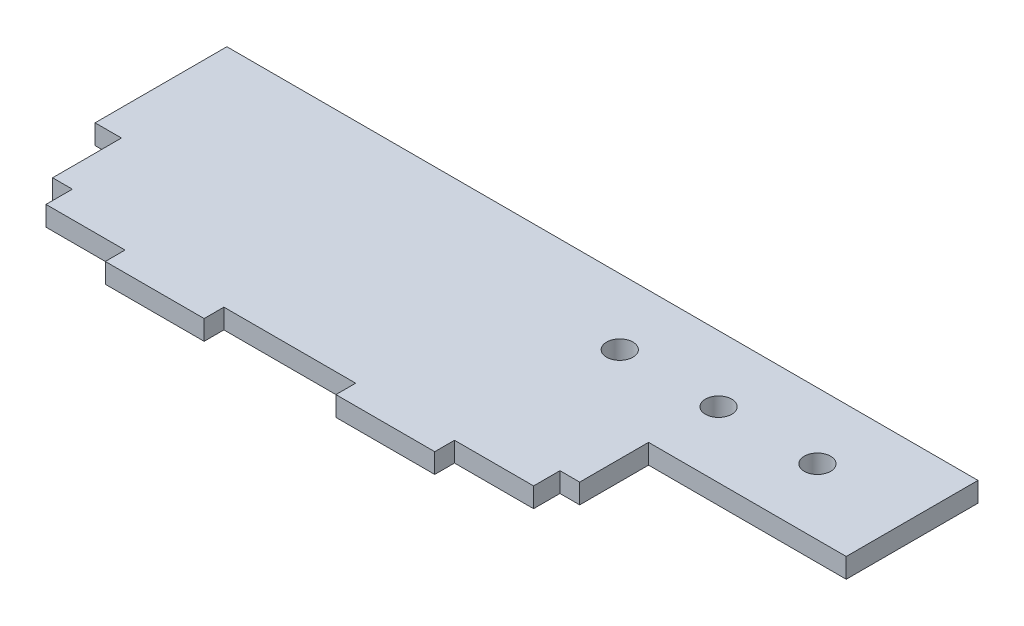
ISO-10303-21;
HEADER;
FILE_DESCRIPTION(('STEP AP214'),'2;1');
FILE_NAME('part.step','',(''),(''),'','','');
FILE_SCHEMA(('AUTOMOTIVE_DESIGN { 1 0 10303 214 1 1 1 1 }'));
ENDSEC;
DATA;
#1=APPLICATION_CONTEXT('core data for automotive mechanical design processes');
#2=APPLICATION_PROTOCOL_DEFINITION('international standard','automotive_design',2000,#1);
#3=PRODUCT_CONTEXT('',#1,'mechanical');
#4=PRODUCT('Part','Part','',(#3));
#5=PRODUCT_RELATED_PRODUCT_CATEGORY('part','',(#4));
#6=PRODUCT_DEFINITION_FORMATION('','',#4);
#7=PRODUCT_DEFINITION_CONTEXT('part definition',#1,'design');
#8=PRODUCT_DEFINITION('design','',#6,#7);
#9=PRODUCT_DEFINITION_SHAPE('','',#8);
#10=(LENGTH_UNIT() NAMED_UNIT(*) SI_UNIT(.MILLI.,.METRE.));
#11=(NAMED_UNIT(*) PLANE_ANGLE_UNIT() SI_UNIT($,.RADIAN.));
#12=(NAMED_UNIT(*) SI_UNIT($,.STERADIAN.) SOLID_ANGLE_UNIT());
#13=UNCERTAINTY_MEASURE_WITH_UNIT(LENGTH_MEASURE(1.E-05),#10,'distance_accuracy_value','');
#14=(GEOMETRIC_REPRESENTATION_CONTEXT(3) GLOBAL_UNCERTAINTY_ASSIGNED_CONTEXT((#13)) GLOBAL_UNIT_ASSIGNED_CONTEXT((#10,
#11,#12)) REPRESENTATION_CONTEXT('',''));
#15=CARTESIAN_POINT('',(0.,0.,0.));
#16=DIRECTION('',(0.,0.,1.));
#17=DIRECTION('',(1.,0.,0.));
#18=AXIS2_PLACEMENT_3D('',#15,#16,#17);
#19=CARTESIAN_POINT('',(40.,3.,0.));
#20=DIRECTION('',(1.,0.,0.));
#21=DIRECTION('',(0.,0.,-1.));
#22=AXIS2_PLACEMENT_3D('',#19,#20,#21);
#23=PLANE('',#22);
#24=DIRECTION('',(0.,1.,0.));
#25=VECTOR('',#24,1.);
#26=CARTESIAN_POINT('',(40.,0.,13.225));
#27=LINE('',#26,#25);
#28=CARTESIAN_POINT('',(40.,0.,13.225));
#29=VERTEX_POINT('',#28);
#30=CARTESIAN_POINT('',(40.,3.,13.225));
#31=VERTEX_POINT('',#30);
#32=EDGE_CURVE('E328',#29,#31,#27,.T.);
#33=ORIENTED_EDGE('',*,*,#32,.F.);
#34=DIRECTION('',(0.,0.,1.));
#35=VECTOR('',#34,1.);
#36=CARTESIAN_POINT('',(40.,0.,0.));
#37=LINE('',#36,#35);
#38=CARTESIAN_POINT('',(40.,0.,2.77499999999999));
#39=VERTEX_POINT('',#38);
#40=EDGE_CURVE('E268',#39,#29,#37,.T.);
#41=ORIENTED_EDGE('',*,*,#40,.F.);
#42=DIRECTION('',(0.,-1.,0.));
#43=VECTOR('',#42,1.);
#44=CARTESIAN_POINT('',(40.,3.,2.77499999999999));
#45=LINE('',#44,#43);
#46=CARTESIAN_POINT('',(40.,3.,2.77499999999999));
#47=VERTEX_POINT('',#46);
#48=EDGE_CURVE('E11',#47,#39,#45,.T.);
#49=ORIENTED_EDGE('',*,*,#48,.F.);
#50=DIRECTION('',(0.,0.,1.));
#51=VECTOR('',#50,1.);
#52=CARTESIAN_POINT('',(40.,3.,0.));
#53=LINE('',#52,#51);
#54=EDGE_CURVE('E212',#47,#31,#53,.T.);
#55=ORIENTED_EDGE('',*,*,#54,.T.);
#56=EDGE_LOOP('',(#33,#41,#49,#55));
#57=FACE_BOUND('',#56,.T.);
#58=ADVANCED_FACE('F43',(#57),#23,.T.);
#59=CARTESIAN_POINT('',(0.,3.,2.77499999999999));
#60=DIRECTION('',(0.,0.,-1.));
#61=DIRECTION('',(-1.,0.,0.));
#62=AXIS2_PLACEMENT_3D('',#59,#60,#61);
#63=PLANE('',#62);
#64=DIRECTION('',(1.,0.,0.));
#65=VECTOR('',#64,1.);
#66=CARTESIAN_POINT('',(0.,0.,2.77499999999999));
#67=LINE('',#66,#65);
#68=CARTESIAN_POINT('',(70.,0.,2.77499999999999));
#69=VERTEX_POINT('',#68);
#70=EDGE_CURVE('E272',#39,#69,#67,.T.);
#71=ORIENTED_EDGE('',*,*,#70,.T.);
#72=DIRECTION('',(0.,-1.,0.));
#73=VECTOR('',#72,1.);
#74=CARTESIAN_POINT('',(70.,3.,2.77499999999999));
#75=LINE('',#74,#73);
#76=CARTESIAN_POINT('',(70.,3.,2.77499999999999));
#77=VERTEX_POINT('',#76);
#78=EDGE_CURVE('E51',#77,#69,#75,.T.);
#79=ORIENTED_EDGE('',*,*,#78,.F.);
#80=DIRECTION('',(1.,0.,0.));
#81=VECTOR('',#80,1.);
#82=CARTESIAN_POINT('',(0.,3.,2.77499999999999));
#83=LINE('',#82,#81);
#84=EDGE_CURVE('E323',#47,#77,#83,.T.);
#85=ORIENTED_EDGE('',*,*,#84,.F.);
#86=ORIENTED_EDGE('',*,*,#48,.T.);
#87=EDGE_LOOP('',(#71,#79,#85,#86));
#88=FACE_BOUND('',#87,.T.);
#89=ADVANCED_FACE('F322',(#88),#63,.F.);
#90=CARTESIAN_POINT('',(70.,3.,0.));
#91=DIRECTION('',(1.,0.,0.));
#92=DIRECTION('',(0.,0.,-1.));
#93=AXIS2_PLACEMENT_3D('',#90,#91,#92);
#94=PLANE('',#93);
#95=DIRECTION('',(0.,0.,1.));
#96=VECTOR('',#95,1.);
#97=CARTESIAN_POINT('',(70.,0.,0.));
#98=LINE('',#97,#96);
#99=CARTESIAN_POINT('',(70.,0.,-17.225));
#100=VERTEX_POINT('',#99);
#101=EDGE_CURVE('E278',#100,#69,#98,.T.);
#102=ORIENTED_EDGE('',*,*,#101,.F.);
#103=DIRECTION('',(0.,-1.,0.));
#104=VECTOR('',#103,1.);
#105=CARTESIAN_POINT('',(70.,3.,-17.225));
#106=LINE('',#105,#104);
#107=CARTESIAN_POINT('',(70.,3.,-17.225));
#108=VERTEX_POINT('',#107);
#109=EDGE_CURVE('E257',#108,#100,#106,.T.);
#110=ORIENTED_EDGE('',*,*,#109,.F.);
#111=DIRECTION('',(0.,0.,1.));
#112=VECTOR('',#111,1.);
#113=CARTESIAN_POINT('',(70.,3.,0.));
#114=LINE('',#113,#112);
#115=EDGE_CURVE('E319',#108,#77,#114,.T.);
#116=ORIENTED_EDGE('',*,*,#115,.T.);
#117=ORIENTED_EDGE('',*,*,#78,.T.);
#118=EDGE_LOOP('',(#102,#110,#116,#117));
#119=FACE_BOUND('',#118,.T.);
#120=ADVANCED_FACE('F315',(#119),#94,.T.);
#121=CARTESIAN_POINT('',(0.,3.,-17.225));
#122=DIRECTION('',(0.,0.,-1.));
#123=DIRECTION('',(-1.,0.,0.));
#124=AXIS2_PLACEMENT_3D('',#121,#122,#123);
#125=PLANE('',#124);
#126=DIRECTION('',(1.,0.,0.));
#127=VECTOR('',#126,1.);
#128=CARTESIAN_POINT('',(0.,0.,-17.225));
#129=LINE('',#128,#127);
#130=CARTESIAN_POINT('',(-44.,0.,-17.225));
#131=VERTEX_POINT('',#130);
#132=EDGE_CURVE('E286',#131,#100,#129,.T.);
#133=ORIENTED_EDGE('',*,*,#132,.F.);
#134=DIRECTION('',(0.,-1.,0.));
#135=VECTOR('',#134,1.);
#136=CARTESIAN_POINT('',(-44.,3.,-17.225));
#137=LINE('',#136,#135);
#138=CARTESIAN_POINT('',(-44.,3.,-17.225));
#139=VERTEX_POINT('',#138);
#140=EDGE_CURVE('E255',#139,#131,#137,.T.);
#141=ORIENTED_EDGE('',*,*,#140,.F.);
#142=DIRECTION('',(1.,0.,0.));
#143=VECTOR('',#142,1.);
#144=CARTESIAN_POINT('',(0.,3.,-17.225));
#145=LINE('',#144,#143);
#146=EDGE_CURVE('E312',#139,#108,#145,.T.);
#147=ORIENTED_EDGE('',*,*,#146,.T.);
#148=ORIENTED_EDGE('',*,*,#109,.T.);
#149=EDGE_LOOP('',(#133,#141,#147,#148));
#150=FACE_BOUND('',#149,.T.);
#151=ADVANCED_FACE('F311',(#150),#125,.T.);
#152=CARTESIAN_POINT('',(-44.,3.,0.));
#153=DIRECTION('',(1.,0.,0.));
#154=DIRECTION('',(0.,0.,-1.));
#155=AXIS2_PLACEMENT_3D('',#152,#153,#154);
#156=PLANE('',#155);
#157=DIRECTION('',(0.,0.,1.));
#158=VECTOR('',#157,1.);
#159=CARTESIAN_POINT('',(-44.,0.,0.));
#160=LINE('',#159,#158);
#161=CARTESIAN_POINT('',(-44.,0.,2.77499999999999));
#162=VERTEX_POINT('',#161);
#163=EDGE_CURVE('E289',#131,#162,#160,.T.);
#164=ORIENTED_EDGE('',*,*,#163,.T.);
#165=DIRECTION('',(0.,-1.,0.));
#166=VECTOR('',#165,1.);
#167=CARTESIAN_POINT('',(-44.,3.,2.77499999999999));
#168=LINE('',#167,#166);
#169=CARTESIAN_POINT('',(-44.,3.,2.77499999999999));
#170=VERTEX_POINT('',#169);
#171=EDGE_CURVE('E253',#170,#162,#168,.T.);
#172=ORIENTED_EDGE('',*,*,#171,.F.);
#173=DIRECTION('',(0.,0.,1.));
#174=VECTOR('',#173,1.);
#175=CARTESIAN_POINT('',(-44.,3.,0.));
#176=LINE('',#175,#174);
#177=EDGE_CURVE('E307',#139,#170,#176,.T.);
#178=ORIENTED_EDGE('',*,*,#177,.F.);
#179=ORIENTED_EDGE('',*,*,#140,.T.);
#180=EDGE_LOOP('',(#164,#172,#178,#179));
#181=FACE_BOUND('',#180,.T.);
#182=ADVANCED_FACE('F306',(#181),#156,.F.);
#183=CARTESIAN_POINT('',(0.,3.,2.77499999999999));
#184=DIRECTION('',(0.,0.,1.));
#185=DIRECTION('',(1.,0.,0.));
#186=AXIS2_PLACEMENT_3D('',#183,#184,#185);
#187=PLANE('',#186);
#188=DIRECTION('',(-1.,0.,0.));
#189=VECTOR('',#188,1.);
#190=CARTESIAN_POINT('',(0.,0.,2.77499999999999));
#191=LINE('',#190,#189);
#192=CARTESIAN_POINT('',(-40.,0.,2.77499999999999));
#193=VERTEX_POINT('',#192);
#194=EDGE_CURVE('E209',#193,#162,#191,.T.);
#195=ORIENTED_EDGE('',*,*,#194,.F.);
#196=DIRECTION('',(0.,-1.,0.));
#197=VECTOR('',#196,1.);
#198=CARTESIAN_POINT('',(-40.,3.,2.77499999999999));
#199=LINE('',#198,#197);
#200=CARTESIAN_POINT('',(-40.,3.,2.77499999999999));
#201=VERTEX_POINT('',#200);
#202=EDGE_CURVE('E251',#201,#193,#199,.T.);
#203=ORIENTED_EDGE('',*,*,#202,.F.);
#204=DIRECTION('',(-1.,0.,0.));
#205=VECTOR('',#204,1.);
#206=CARTESIAN_POINT('',(0.,3.,2.77499999999999));
#207=LINE('',#206,#205);
#208=EDGE_CURVE('E303',#201,#170,#207,.T.);
#209=ORIENTED_EDGE('',*,*,#208,.T.);
#210=ORIENTED_EDGE('',*,*,#171,.T.);
#211=EDGE_LOOP('',(#195,#203,#209,#210));
#212=FACE_BOUND('',#211,.T.);
#213=ADVANCED_FACE('F298',(#212),#187,.T.);
#214=CARTESIAN_POINT('',(-40.,3.,0.));
#215=DIRECTION('',(1.,0.,0.));
#216=DIRECTION('',(0.,0.,-1.));
#217=AXIS2_PLACEMENT_3D('',#214,#215,#216);
#218=PLANE('',#217);
#219=DIRECTION('',(0.,0.,1.));
#220=VECTOR('',#219,1.);
#221=CARTESIAN_POINT('',(-40.,0.,0.));
#222=LINE('',#221,#220);
#223=CARTESIAN_POINT('',(-40.,0.,13.225));
#224=VERTEX_POINT('',#223);
#225=EDGE_CURVE('E202',#193,#224,#222,.T.);
#226=ORIENTED_EDGE('',*,*,#225,.T.);
#227=DIRECTION('',(0.,1.,0.));
#228=VECTOR('',#227,1.);
#229=CARTESIAN_POINT('',(-40.,0.,13.225));
#230=LINE('',#229,#228);
#231=CARTESIAN_POINT('',(-40.,3.,13.225));
#232=VERTEX_POINT('',#231);
#233=EDGE_CURVE('E356',#224,#232,#230,.T.);
#234=ORIENTED_EDGE('',*,*,#233,.T.);
#235=DIRECTION('',(0.,0.,1.));
#236=VECTOR('',#235,1.);
#237=CARTESIAN_POINT('',(-40.,3.,0.));
#238=LINE('',#237,#236);
#239=EDGE_CURVE('E363',#201,#232,#238,.T.);
#240=ORIENTED_EDGE('',*,*,#239,.F.);
#241=ORIENTED_EDGE('',*,*,#202,.T.);
#242=EDGE_LOOP('',(#226,#234,#240,#241));
#243=FACE_BOUND('',#242,.T.);
#244=ADVANCED_FACE('F409',(#243),#218,.F.);
#245=CARTESIAN_POINT('',(0.,3.,17.225));
#246=DIRECTION('',(0.,0.,-1.));
#247=DIRECTION('',(-1.,0.,0.));
#248=AXIS2_PLACEMENT_3D('',#245,#246,#247);
#249=PLANE('',#248);
#250=DIRECTION('',(1.,0.,0.));
#251=VECTOR('',#250,1.);
#252=CARTESIAN_POINT('',(0.,3.,17.225));
#253=LINE('',#252,#251);
#254=CARTESIAN_POINT('',(-37.,3.,17.225));
#255=VERTEX_POINT('',#254);
#256=CARTESIAN_POINT('',(-25.,3.,17.225));
#257=VERTEX_POINT('',#256);
#258=EDGE_CURVE('E196',#255,#257,#253,.T.);
#259=ORIENTED_EDGE('',*,*,#258,.F.);
#260=DIRECTION('',(0.,1.,0.));
#261=VECTOR('',#260,1.);
#262=CARTESIAN_POINT('',(-37.,0.,17.225));
#263=LINE('',#262,#261);
#264=CARTESIAN_POINT('',(-37.,0.,17.225));
#265=VERTEX_POINT('',#264);
#266=EDGE_CURVE('E183',#265,#255,#263,.T.);
#267=ORIENTED_EDGE('',*,*,#266,.F.);
#268=DIRECTION('',(1.,0.,0.));
#269=VECTOR('',#268,1.);
#270=CARTESIAN_POINT('',(0.,0.,17.225));
#271=LINE('',#270,#269);
#272=CARTESIAN_POINT('',(-25.,0.,17.225));
#273=VERTEX_POINT('',#272);
#274=EDGE_CURVE('E194',#265,#273,#271,.T.);
#275=ORIENTED_EDGE('',*,*,#274,.T.);
#276=DIRECTION('',(0.,-1.,0.));
#277=VECTOR('',#276,1.);
#278=CARTESIAN_POINT('',(-25.,3.,17.225));
#279=LINE('',#278,#277);
#280=EDGE_CURVE('E249',#257,#273,#279,.T.);
#281=ORIENTED_EDGE('',*,*,#280,.F.);
#282=EDGE_LOOP('',(#259,#267,#275,#281));
#283=FACE_BOUND('',#282,.T.);
#284=ADVANCED_FACE('F192',(#283),#249,.F.);
#285=CARTESIAN_POINT('',(-25.,3.,0.));
#286=DIRECTION('',(1.,0.,0.));
#287=DIRECTION('',(0.,0.,-1.));
#288=AXIS2_PLACEMENT_3D('',#285,#286,#287);
#289=PLANE('',#288);
#290=DIRECTION('',(0.,0.,1.));
#291=VECTOR('',#290,1.);
#292=CARTESIAN_POINT('',(-25.,0.,0.));
#293=LINE('',#292,#291);
#294=CARTESIAN_POINT('',(-25.,0.,20.225));
#295=VERTEX_POINT('',#294);
#296=EDGE_CURVE('E201',#273,#295,#293,.T.);
#297=ORIENTED_EDGE('',*,*,#296,.T.);
#298=DIRECTION('',(0.,-1.,0.));
#299=VECTOR('',#298,1.);
#300=CARTESIAN_POINT('',(-25.,3.,20.225));
#301=LINE('',#300,#299);
#302=CARTESIAN_POINT('',(-25.,3.,20.225));
#303=VERTEX_POINT('',#302);
#304=EDGE_CURVE('E246',#303,#295,#301,.T.);
#305=ORIENTED_EDGE('',*,*,#304,.F.);
#306=DIRECTION('',(0.,0.,1.));
#307=VECTOR('',#306,1.);
#308=CARTESIAN_POINT('',(-25.,3.,0.));
#309=LINE('',#308,#307);
#310=EDGE_CURVE('E367',#257,#303,#309,.T.);
#311=ORIENTED_EDGE('',*,*,#310,.F.);
#312=ORIENTED_EDGE('',*,*,#280,.T.);
#313=EDGE_LOOP('',(#297,#305,#311,#312));
#314=FACE_BOUND('',#313,.T.);
#315=ADVANCED_FACE('F417',(#314),#289,.F.);
#316=CARTESIAN_POINT('',(0.,3.,20.225));
#317=DIRECTION('',(0.,0.,-1.));
#318=DIRECTION('',(-1.,0.,0.));
#319=AXIS2_PLACEMENT_3D('',#316,#317,#318);
#320=PLANE('',#319);
#321=DIRECTION('',(1.,0.,0.));
#322=VECTOR('',#321,1.);
#323=CARTESIAN_POINT('',(0.,0.,20.225));
#324=LINE('',#323,#322);
#325=CARTESIAN_POINT('',(-10.,0.,20.225));
#326=VERTEX_POINT('',#325);
#327=EDGE_CURVE('E206',#295,#326,#324,.T.);
#328=ORIENTED_EDGE('',*,*,#327,.T.);
#329=DIRECTION('',(0.,-1.,0.));
#330=VECTOR('',#329,1.);
#331=CARTESIAN_POINT('',(-10.,3.,20.225));
#332=LINE('',#331,#330);
#333=CARTESIAN_POINT('',(-10.,3.,20.225));
#334=VERTEX_POINT('',#333);
#335=EDGE_CURVE('E244',#334,#326,#332,.T.);
#336=ORIENTED_EDGE('',*,*,#335,.F.);
#337=DIRECTION('',(1.,0.,0.));
#338=VECTOR('',#337,1.);
#339=CARTESIAN_POINT('',(0.,3.,20.225));
#340=LINE('',#339,#338);
#341=EDGE_CURVE('E370',#303,#334,#340,.T.);
#342=ORIENTED_EDGE('',*,*,#341,.F.);
#343=ORIENTED_EDGE('',*,*,#304,.T.);
#344=EDGE_LOOP('',(#328,#336,#342,#343));
#345=FACE_BOUND('',#344,.T.);
#346=ADVANCED_FACE('F421',(#345),#320,.F.);
#347=CARTESIAN_POINT('',(-10.,3.,0.));
#348=DIRECTION('',(1.,0.,0.));
#349=DIRECTION('',(0.,0.,-1.));
#350=AXIS2_PLACEMENT_3D('',#347,#348,#349);
#351=PLANE('',#350);
#352=DIRECTION('',(0.,0.,1.));
#353=VECTOR('',#352,1.);
#354=CARTESIAN_POINT('',(-10.,0.,0.));
#355=LINE('',#354,#353);
#356=CARTESIAN_POINT('',(-10.,0.,17.225));
#357=VERTEX_POINT('',#356);
#358=EDGE_CURVE('E215',#357,#326,#355,.T.);
#359=ORIENTED_EDGE('',*,*,#358,.F.);
#360=DIRECTION('',(0.,-1.,0.));
#361=VECTOR('',#360,1.);
#362=CARTESIAN_POINT('',(-10.,3.,17.225));
#363=LINE('',#362,#361);
#364=CARTESIAN_POINT('',(-10.,3.,17.225));
#365=VERTEX_POINT('',#364);
#366=EDGE_CURVE('E242',#365,#357,#363,.T.);
#367=ORIENTED_EDGE('',*,*,#366,.F.);
#368=DIRECTION('',(0.,0.,1.));
#369=VECTOR('',#368,1.);
#370=CARTESIAN_POINT('',(-10.,3.,0.));
#371=LINE('',#370,#369);
#372=EDGE_CURVE('E372',#365,#334,#371,.T.);
#373=ORIENTED_EDGE('',*,*,#372,.T.);
#374=ORIENTED_EDGE('',*,*,#335,.T.);
#375=EDGE_LOOP('',(#359,#367,#373,#374));
#376=FACE_BOUND('',#375,.T.);
#377=ADVANCED_FACE('F423',(#376),#351,.T.);
#378=CARTESIAN_POINT('',(10.,0.,17.225));
#379=VERTEX_POINT('',#378);
#380=EDGE_CURVE('E205',#357,#379,#271,.T.);
#381=ORIENTED_EDGE('',*,*,#380,.T.);
#382=DIRECTION('',(0.,-1.,0.));
#383=VECTOR('',#382,1.);
#384=CARTESIAN_POINT('',(10.,3.,17.225));
#385=LINE('',#384,#383);
#386=CARTESIAN_POINT('',(10.,3.,17.225));
#387=VERTEX_POINT('',#386);
#388=EDGE_CURVE('E240',#387,#379,#385,.T.);
#389=ORIENTED_EDGE('',*,*,#388,.F.);
#390=EDGE_CURVE('E368',#365,#387,#253,.T.);
#391=ORIENTED_EDGE('',*,*,#390,.F.);
#392=ORIENTED_EDGE('',*,*,#366,.T.);
#393=EDGE_LOOP('',(#381,#389,#391,#392));
#394=FACE_BOUND('',#393,.T.);
#395=ADVANCED_FACE('F394',(#394),#249,.F.);
#396=CARTESIAN_POINT('',(10.,3.,0.));
#397=DIRECTION('',(1.,0.,0.));
#398=DIRECTION('',(0.,0.,-1.));
#399=AXIS2_PLACEMENT_3D('',#396,#397,#398);
#400=PLANE('',#399);
#401=DIRECTION('',(0.,0.,1.));
#402=VECTOR('',#401,1.);
#403=CARTESIAN_POINT('',(10.,0.,0.));
#404=LINE('',#403,#402);
#405=CARTESIAN_POINT('',(10.,0.,20.225));
#406=VERTEX_POINT('',#405);
#407=EDGE_CURVE('E214',#379,#406,#404,.T.);
#408=ORIENTED_EDGE('',*,*,#407,.T.);
#409=DIRECTION('',(0.,-1.,0.));
#410=VECTOR('',#409,1.);
#411=CARTESIAN_POINT('',(10.,3.,20.225));
#412=LINE('',#411,#410);
#413=CARTESIAN_POINT('',(10.,3.,20.225));
#414=VERTEX_POINT('',#413);
#415=EDGE_CURVE('E238',#414,#406,#412,.T.);
#416=ORIENTED_EDGE('',*,*,#415,.F.);
#417=DIRECTION('',(0.,0.,1.));
#418=VECTOR('',#417,1.);
#419=CARTESIAN_POINT('',(10.,3.,0.));
#420=LINE('',#419,#418);
#421=EDGE_CURVE('E375',#387,#414,#420,.T.);
#422=ORIENTED_EDGE('',*,*,#421,.F.);
#423=ORIENTED_EDGE('',*,*,#388,.T.);
#424=EDGE_LOOP('',(#408,#416,#422,#423));
#425=FACE_BOUND('',#424,.T.);
#426=ADVANCED_FACE('F397',(#425),#400,.F.);
#427=CARTESIAN_POINT('',(0.,3.,20.225));
#428=DIRECTION('',(0.,0.,1.));
#429=DIRECTION('',(1.,0.,0.));
#430=AXIS2_PLACEMENT_3D('',#427,#428,#429);
#431=PLANE('',#430);
#432=DIRECTION('',(-1.,0.,0.));
#433=VECTOR('',#432,1.);
#434=CARTESIAN_POINT('',(0.,0.,20.225));
#435=LINE('',#434,#433);
#436=CARTESIAN_POINT('',(25.,0.,20.225));
#437=VERTEX_POINT('',#436);
#438=EDGE_CURVE('E221',#437,#406,#435,.T.);
#439=ORIENTED_EDGE('',*,*,#438,.F.);
#440=DIRECTION('',(0.,-1.,0.));
#441=VECTOR('',#440,1.);
#442=CARTESIAN_POINT('',(25.,3.,20.225));
#443=LINE('',#442,#441);
#444=CARTESIAN_POINT('',(25.,3.,20.225));
#445=VERTEX_POINT('',#444);
#446=EDGE_CURVE('E235',#445,#437,#443,.T.);
#447=ORIENTED_EDGE('',*,*,#446,.F.);
#448=DIRECTION('',(-1.,0.,0.));
#449=VECTOR('',#448,1.);
#450=CARTESIAN_POINT('',(0.,3.,20.225));
#451=LINE('',#450,#449);
#452=EDGE_CURVE('E376',#445,#414,#451,.T.);
#453=ORIENTED_EDGE('',*,*,#452,.T.);
#454=ORIENTED_EDGE('',*,*,#415,.T.);
#455=EDGE_LOOP('',(#439,#447,#453,#454));
#456=FACE_BOUND('',#455,.T.);
#457=ADVANCED_FACE('F399',(#456),#431,.T.);
#458=CARTESIAN_POINT('',(25.,3.,0.));
#459=DIRECTION('',(1.,0.,0.));
#460=DIRECTION('',(0.,0.,-1.));
#461=AXIS2_PLACEMENT_3D('',#458,#459,#460);
#462=PLANE('',#461);
#463=DIRECTION('',(0.,0.,1.));
#464=VECTOR('',#463,1.);
#465=CARTESIAN_POINT('',(25.,0.,0.));
#466=LINE('',#465,#464);
#467=CARTESIAN_POINT('',(25.,0.,17.225));
#468=VERTEX_POINT('',#467);
#469=EDGE_CURVE('E213',#468,#437,#466,.T.);
#470=ORIENTED_EDGE('',*,*,#469,.F.);
#471=DIRECTION('',(0.,-1.,0.));
#472=VECTOR('',#471,1.);
#473=CARTESIAN_POINT('',(25.,3.,17.225));
#474=LINE('',#473,#472);
#475=CARTESIAN_POINT('',(25.,3.,17.225));
#476=VERTEX_POINT('',#475);
#477=EDGE_CURVE('E233',#476,#468,#474,.T.);
#478=ORIENTED_EDGE('',*,*,#477,.F.);
#479=DIRECTION('',(0.,0.,1.));
#480=VECTOR('',#479,1.);
#481=CARTESIAN_POINT('',(25.,3.,0.));
#482=LINE('',#481,#480);
#483=EDGE_CURVE('E281',#476,#445,#482,.T.);
#484=ORIENTED_EDGE('',*,*,#483,.T.);
#485=ORIENTED_EDGE('',*,*,#446,.T.);
#486=EDGE_LOOP('',(#470,#478,#484,#485));
#487=FACE_BOUND('',#486,.T.);
#488=ADVANCED_FACE('F402',(#487),#462,.T.);
#489=CARTESIAN_POINT('',(37.,0.,17.225));
#490=VERTEX_POINT('',#489);
#491=EDGE_CURVE('E204',#468,#490,#271,.T.);
#492=ORIENTED_EDGE('',*,*,#491,.T.);
#493=DIRECTION('',(0.,1.,0.));
#494=VECTOR('',#493,1.);
#495=CARTESIAN_POINT('',(37.,0.,17.225));
#496=LINE('',#495,#494);
#497=CARTESIAN_POINT('',(37.,3.,17.225));
#498=VERTEX_POINT('',#497);
#499=EDGE_CURVE('E336',#490,#498,#496,.T.);
#500=ORIENTED_EDGE('',*,*,#499,.T.);
#501=EDGE_CURVE('E236',#476,#498,#253,.T.);
#502=ORIENTED_EDGE('',*,*,#501,.F.);
#503=ORIENTED_EDGE('',*,*,#477,.T.);
#504=EDGE_LOOP('',(#492,#500,#502,#503));
#505=FACE_BOUND('',#504,.T.);
#506=ADVANCED_FACE('F404',(#505),#249,.F.);
#507=CARTESIAN_POINT('',(0.,3.,0.));
#508=DIRECTION('',(0.,1.,0.));
#509=DIRECTION('',(0.,0.,1.));
#510=AXIS2_PLACEMENT_3D('',#507,#508,#509);
#511=PLANE('',#510);
#512=DIRECTION('',(-1.,0.,0.));
#513=VECTOR('',#512,1.);
#514=CARTESIAN_POINT('',(-40.,3.,13.225));
#515=LINE('',#514,#513);
#516=CARTESIAN_POINT('',(-37.,3.,13.225));
#517=VERTEX_POINT('',#516);
#518=EDGE_CURVE('E188',#517,#232,#515,.T.);
#519=ORIENTED_EDGE('',*,*,#518,.F.);
#520=DIRECTION('',(0.,0.,-1.));
#521=VECTOR('',#520,1.);
#522=CARTESIAN_POINT('',(-37.,3.,17.225));
#523=LINE('',#522,#521);
#524=EDGE_CURVE('E345',#255,#517,#523,.T.);
#525=ORIENTED_EDGE('',*,*,#524,.F.);
#526=ORIENTED_EDGE('',*,*,#258,.T.);
#527=ORIENTED_EDGE('',*,*,#310,.T.);
#528=ORIENTED_EDGE('',*,*,#341,.T.);
#529=ORIENTED_EDGE('',*,*,#372,.F.);
#530=ORIENTED_EDGE('',*,*,#390,.T.);
#531=ORIENTED_EDGE('',*,*,#421,.T.);
#532=ORIENTED_EDGE('',*,*,#452,.F.);
#533=ORIENTED_EDGE('',*,*,#483,.F.);
#534=ORIENTED_EDGE('',*,*,#501,.T.);
#535=DIRECTION('',(0.,0.,1.));
#536=VECTOR('',#535,1.);
#537=CARTESIAN_POINT('',(37.,3.,17.225));
#538=LINE('',#537,#536);
#539=CARTESIAN_POINT('',(37.,3.,13.225));
#540=VERTEX_POINT('',#539);
#541=EDGE_CURVE('E342',#540,#498,#538,.T.);
#542=ORIENTED_EDGE('',*,*,#541,.F.);
#543=DIRECTION('',(-1.,0.,0.));
#544=VECTOR('',#543,1.);
#545=CARTESIAN_POINT('',(40.,3.,13.225));
#546=LINE('',#545,#544);
#547=EDGE_CURVE('E344',#31,#540,#546,.T.);
#548=ORIENTED_EDGE('',*,*,#547,.F.);
#549=ORIENTED_EDGE('',*,*,#54,.F.);
#550=ORIENTED_EDGE('',*,*,#84,.T.);
#551=ORIENTED_EDGE('',*,*,#115,.F.);
#552=ORIENTED_EDGE('',*,*,#146,.F.);
#553=ORIENTED_EDGE('',*,*,#177,.T.);
#554=ORIENTED_EDGE('',*,*,#208,.F.);
#555=ORIENTED_EDGE('',*,*,#239,.T.);
#556=EDGE_LOOP('',(#519,#525,#526,#527,#528,#529,#530,#531,#532,#533,#534,#542,#548,#549,#550,
#551,#552,#553,#554,#555));
#557=FACE_BOUND('',#556,.T.);
#558=CARTESIAN_POINT('',(55.63,3.,-7.22500000000001));
#559=DIRECTION('',(0.,1.,0.));
#560=DIRECTION('',(0.,0.,1.));
#561=AXIS2_PLACEMENT_3D('',#558,#559,#560);
#562=CIRCLE('',#561,2.);
#563=CARTESIAN_POINT('',(55.63,3.,-5.22500000000001));
#564=VERTEX_POINT('',#563);
#565=EDGE_CURVE('E263',#564,#564,#562,.T.);
#566=ORIENTED_EDGE('',*,*,#565,.F.);
#567=EDGE_LOOP('',(#566));
#568=FACE_BOUND('',#567,.T.);
#569=CARTESIAN_POINT('',(40.63,3.,-7.22500000000001));
#570=DIRECTION('',(0.,1.,0.));
#571=DIRECTION('',(0.,0.,1.));
#572=AXIS2_PLACEMENT_3D('',#569,#570,#571);
#573=CIRCLE('',#572,2.);
#574=CARTESIAN_POINT('',(40.63,3.,-5.225));
#575=VERTEX_POINT('',#574);
#576=EDGE_CURVE('E350',#575,#575,#573,.T.);
#577=ORIENTED_EDGE('',*,*,#576,.F.);
#578=EDGE_LOOP('',(#577));
#579=FACE_BOUND('',#578,.T.);
#580=CARTESIAN_POINT('',(25.63,3.,-7.22500000000001));
#581=DIRECTION('',(0.,1.,0.));
#582=DIRECTION('',(0.,0.,1.));
#583=AXIS2_PLACEMENT_3D('',#580,#581,#582);
#584=CIRCLE('',#583,2.);
#585=CARTESIAN_POINT('',(25.63,3.,-5.225));
#586=VERTEX_POINT('',#585);
#587=EDGE_CURVE('E353',#586,#586,#584,.T.);
#588=ORIENTED_EDGE('',*,*,#587,.F.);
#589=EDGE_LOOP('',(#588));
#590=FACE_BOUND('',#589,.T.);
#591=ADVANCED_FACE('F390',(#557,#568,#579,#590),#511,.T.);
#592=CARTESIAN_POINT('',(0.,0.,0.));
#593=DIRECTION('',(0.,1.,0.));
#594=DIRECTION('',(0.,0.,1.));
#595=AXIS2_PLACEMENT_3D('',#592,#593,#594);
#596=PLANE('',#595);
#597=CARTESIAN_POINT('',(55.63,0.,-7.22500000000001));
#598=DIRECTION('',(0.,1.,0.));
#599=DIRECTION('',(0.,0.,1.));
#600=AXIS2_PLACEMENT_3D('',#597,#598,#599);
#601=CIRCLE('',#600,2.);
#602=CARTESIAN_POINT('',(55.63,0.,-5.22500000000001));
#603=VERTEX_POINT('',#602);
#604=EDGE_CURVE('E46',#603,#603,#601,.T.);
#605=ORIENTED_EDGE('',*,*,#604,.T.);
#606=EDGE_LOOP('',(#605));
#607=FACE_BOUND('',#606,.T.);
#608=CARTESIAN_POINT('',(40.63,0.,-7.22500000000001));
#609=DIRECTION('',(0.,1.,0.));
#610=DIRECTION('',(0.,0.,1.));
#611=AXIS2_PLACEMENT_3D('',#608,#609,#610);
#612=CIRCLE('',#611,2.);
#613=CARTESIAN_POINT('',(40.63,0.,-5.225));
#614=VERTEX_POINT('',#613);
#615=EDGE_CURVE('E262',#614,#614,#612,.T.);
#616=ORIENTED_EDGE('',*,*,#615,.T.);
#617=EDGE_LOOP('',(#616));
#618=FACE_BOUND('',#617,.T.);
#619=CARTESIAN_POINT('',(25.63,0.,-7.22500000000001));
#620=DIRECTION('',(0.,1.,0.));
#621=DIRECTION('',(0.,0.,1.));
#622=AXIS2_PLACEMENT_3D('',#619,#620,#621);
#623=CIRCLE('',#622,2.);
#624=CARTESIAN_POINT('',(25.63,0.,-5.225));
#625=VERTEX_POINT('',#624);
#626=EDGE_CURVE('E260',#625,#625,#623,.T.);
#627=ORIENTED_EDGE('',*,*,#626,.T.);
#628=EDGE_LOOP('',(#627));
#629=FACE_BOUND('',#628,.T.);
#630=DIRECTION('',(0.,0.,-1.));
#631=VECTOR('',#630,1.);
#632=CARTESIAN_POINT('',(-37.,0.,17.225));
#633=LINE('',#632,#631);
#634=CARTESIAN_POINT('',(-37.,0.,13.225));
#635=VERTEX_POINT('',#634);
#636=EDGE_CURVE('E179',#265,#635,#633,.T.);
#637=ORIENTED_EDGE('',*,*,#636,.T.);
#638=DIRECTION('',(-1.,0.,0.));
#639=VECTOR('',#638,1.);
#640=CARTESIAN_POINT('',(-40.,0.,13.225));
#641=LINE('',#640,#639);
#642=EDGE_CURVE('E59',#635,#224,#641,.T.);
#643=ORIENTED_EDGE('',*,*,#642,.T.);
#644=ORIENTED_EDGE('',*,*,#225,.F.);
#645=ORIENTED_EDGE('',*,*,#194,.T.);
#646=ORIENTED_EDGE('',*,*,#163,.F.);
#647=ORIENTED_EDGE('',*,*,#132,.T.);
#648=ORIENTED_EDGE('',*,*,#101,.T.);
#649=ORIENTED_EDGE('',*,*,#70,.F.);
#650=ORIENTED_EDGE('',*,*,#40,.T.);
#651=DIRECTION('',(-1.,0.,0.));
#652=VECTOR('',#651,1.);
#653=CARTESIAN_POINT('',(40.,0.,13.225));
#654=LINE('',#653,#652);
#655=CARTESIAN_POINT('',(37.,0.,13.225));
#656=VERTEX_POINT('',#655);
#657=EDGE_CURVE('E334',#29,#656,#654,.T.);
#658=ORIENTED_EDGE('',*,*,#657,.T.);
#659=DIRECTION('',(0.,0.,1.));
#660=VECTOR('',#659,1.);
#661=CARTESIAN_POINT('',(37.,0.,17.225));
#662=LINE('',#661,#660);
#663=EDGE_CURVE('E67',#656,#490,#662,.T.);
#664=ORIENTED_EDGE('',*,*,#663,.T.);
#665=ORIENTED_EDGE('',*,*,#491,.F.);
#666=ORIENTED_EDGE('',*,*,#469,.T.);
#667=ORIENTED_EDGE('',*,*,#438,.T.);
#668=ORIENTED_EDGE('',*,*,#407,.F.);
#669=ORIENTED_EDGE('',*,*,#380,.F.);
#670=ORIENTED_EDGE('',*,*,#358,.T.);
#671=ORIENTED_EDGE('',*,*,#327,.F.);
#672=ORIENTED_EDGE('',*,*,#296,.F.);
#673=ORIENTED_EDGE('',*,*,#274,.F.);
#674=EDGE_LOOP('',(#637,#643,#644,#645,#646,#647,#648,#649,#650,#658,#664,#665,#666,#667,#668,
#669,#670,#671,#672,#673));
#675=FACE_BOUND('',#674,.T.);
#676=ADVANCED_FACE('F199',(#607,#618,#629,#675),#596,.F.);
#677=CARTESIAN_POINT('',(25.63,-7.,-7.22500000000001));
#678=DIRECTION('',(0.,1.,0.));
#679=DIRECTION('',(0.,0.,1.));
#680=AXIS2_PLACEMENT_3D('',#677,#678,#679);
#681=CYLINDRICAL_SURFACE('',#680,2.);
#682=ORIENTED_EDGE('',*,*,#587,.T.);
#683=EDGE_LOOP('',(#682));
#684=FACE_BOUND('',#683,.T.);
#685=ORIENTED_EDGE('',*,*,#626,.F.);
#686=EDGE_LOOP('',(#685));
#687=FACE_BOUND('',#686,.T.);
#688=ADVANCED_FACE('F489',(#684,#687),#681,.F.);
#689=CARTESIAN_POINT('',(40.63,-7.,-7.22500000000001));
#690=DIRECTION('',(0.,1.,0.));
#691=DIRECTION('',(0.,0.,1.));
#692=AXIS2_PLACEMENT_3D('',#689,#690,#691);
#693=CYLINDRICAL_SURFACE('',#692,2.);
#694=ORIENTED_EDGE('',*,*,#576,.T.);
#695=EDGE_LOOP('',(#694));
#696=FACE_BOUND('',#695,.T.);
#697=ORIENTED_EDGE('',*,*,#615,.F.);
#698=EDGE_LOOP('',(#697));
#699=FACE_BOUND('',#698,.T.);
#700=ADVANCED_FACE('F494',(#696,#699),#693,.F.);
#701=CARTESIAN_POINT('',(55.63,-7.,-7.22500000000001));
#702=DIRECTION('',(0.,1.,0.));
#703=DIRECTION('',(0.,0.,1.));
#704=AXIS2_PLACEMENT_3D('',#701,#702,#703);
#705=CYLINDRICAL_SURFACE('',#704,2.);
#706=ORIENTED_EDGE('',*,*,#565,.T.);
#707=EDGE_LOOP('',(#706));
#708=FACE_BOUND('',#707,.T.);
#709=ORIENTED_EDGE('',*,*,#604,.F.);
#710=EDGE_LOOP('',(#709));
#711=FACE_BOUND('',#710,.T.);
#712=ADVANCED_FACE('F507',(#708,#711),#705,.F.);
#713=CARTESIAN_POINT('',(37.,0.,17.225));
#714=DIRECTION('',(-1.,0.,0.));
#715=DIRECTION('',(0.,0.,1.));
#716=AXIS2_PLACEMENT_3D('',#713,#714,#715);
#717=PLANE('',#716);
#718=ORIENTED_EDGE('',*,*,#541,.T.);
#719=ORIENTED_EDGE('',*,*,#499,.F.);
#720=ORIENTED_EDGE('',*,*,#663,.F.);
#721=DIRECTION('',(0.,1.,0.));
#722=VECTOR('',#721,1.);
#723=CARTESIAN_POINT('',(37.,0.,13.225));
#724=LINE('',#723,#722);
#725=EDGE_CURVE('E332',#656,#540,#724,.T.);
#726=ORIENTED_EDGE('',*,*,#725,.T.);
#727=EDGE_LOOP('',(#718,#719,#720,#726));
#728=FACE_BOUND('',#727,.T.);
#729=ADVANCED_FACE('F405',(#728),#717,.F.);
#730=CARTESIAN_POINT('',(40.,0.,13.225));
#731=DIRECTION('',(0.,0.,-1.));
#732=DIRECTION('',(-1.,0.,0.));
#733=AXIS2_PLACEMENT_3D('',#730,#731,#732);
#734=PLANE('',#733);
#735=ORIENTED_EDGE('',*,*,#547,.T.);
#736=ORIENTED_EDGE('',*,*,#725,.F.);
#737=ORIENTED_EDGE('',*,*,#657,.F.);
#738=ORIENTED_EDGE('',*,*,#32,.T.);
#739=EDGE_LOOP('',(#735,#736,#737,#738));
#740=FACE_BOUND('',#739,.T.);
#741=ADVANCED_FACE('F406',(#740),#734,.F.);
#742=CARTESIAN_POINT('',(-40.,0.,13.225));
#743=DIRECTION('',(0.,0.,-1.));
#744=DIRECTION('',(-1.,0.,0.));
#745=AXIS2_PLACEMENT_3D('',#742,#743,#744);
#746=PLANE('',#745);
#747=ORIENTED_EDGE('',*,*,#518,.T.);
#748=ORIENTED_EDGE('',*,*,#233,.F.);
#749=ORIENTED_EDGE('',*,*,#642,.F.);
#750=DIRECTION('',(0.,1.,0.));
#751=VECTOR('',#750,1.);
#752=CARTESIAN_POINT('',(-37.,0.,13.225));
#753=LINE('',#752,#751);
#754=EDGE_CURVE('E185',#635,#517,#753,.T.);
#755=ORIENTED_EDGE('',*,*,#754,.T.);
#756=EDGE_LOOP('',(#747,#748,#749,#755));
#757=FACE_BOUND('',#756,.T.);
#758=ADVANCED_FACE('F577',(#757),#746,.F.);
#759=CARTESIAN_POINT('',(-37.,0.,17.225));
#760=DIRECTION('',(1.,0.,0.));
#761=DIRECTION('',(0.,0.,-1.));
#762=AXIS2_PLACEMENT_3D('',#759,#760,#761);
#763=PLANE('',#762);
#764=ORIENTED_EDGE('',*,*,#524,.T.);
#765=ORIENTED_EDGE('',*,*,#754,.F.);
#766=ORIENTED_EDGE('',*,*,#636,.F.);
#767=ORIENTED_EDGE('',*,*,#266,.T.);
#768=EDGE_LOOP('',(#764,#765,#766,#767));
#769=FACE_BOUND('',#768,.T.);
#770=ADVANCED_FACE('F182',(#769),#763,.F.);
#771=CLOSED_SHELL('',(#58,#89,#120,#151,#182,#213,#244,#284,#315,#346,#377,#395,#426,#457,#488,
#506,#591,#676,#688,#700,#712,#729,#741,#758,#770));
#772=MANIFOLD_SOLID_BREP('B2',#771);
#773=ADVANCED_BREP_SHAPE_REPRESENTATION('',(#18,#772),#14);
#774=SHAPE_DEFINITION_REPRESENTATION(#9,#773);
ENDSEC;
END-ISO-10303-21;
